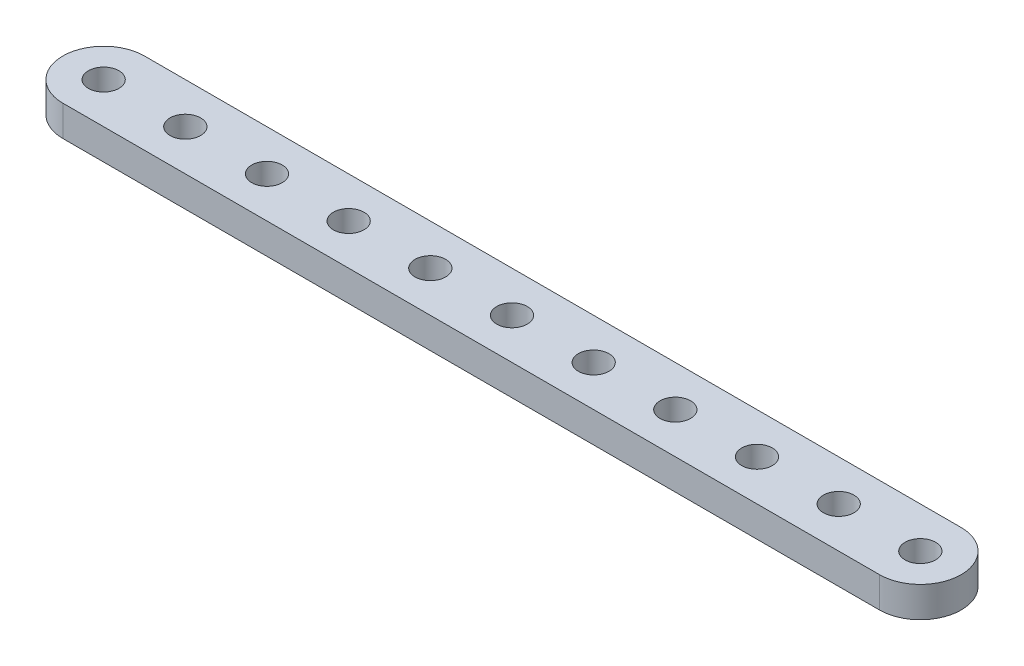
ISO-10303-21;
HEADER;
FILE_DESCRIPTION(('STEP AP214'),'2;1');
FILE_NAME('part.step','',(''),(''),'','','');
FILE_SCHEMA(('AUTOMOTIVE_DESIGN { 1 0 10303 214 1 1 1 1 }'));
ENDSEC;
DATA;
#1=APPLICATION_CONTEXT('core data for automotive mechanical design processes');
#2=APPLICATION_PROTOCOL_DEFINITION('international standard','automotive_design',2000,#1);
#3=PRODUCT_CONTEXT('',#1,'mechanical');
#4=PRODUCT('Part','Part','',(#3));
#5=PRODUCT_RELATED_PRODUCT_CATEGORY('part','',(#4));
#6=PRODUCT_DEFINITION_FORMATION('','',#4);
#7=PRODUCT_DEFINITION_CONTEXT('part definition',#1,'design');
#8=PRODUCT_DEFINITION('design','',#6,#7);
#9=PRODUCT_DEFINITION_SHAPE('','',#8);
#10=(LENGTH_UNIT() NAMED_UNIT(*) SI_UNIT(.MILLI.,.METRE.));
#11=(NAMED_UNIT(*) PLANE_ANGLE_UNIT() SI_UNIT($,.RADIAN.));
#12=(NAMED_UNIT(*) SI_UNIT($,.STERADIAN.) SOLID_ANGLE_UNIT());
#13=UNCERTAINTY_MEASURE_WITH_UNIT(LENGTH_MEASURE(1.E-05),#10,'distance_accuracy_value','');
#14=(GEOMETRIC_REPRESENTATION_CONTEXT(3) GLOBAL_UNCERTAINTY_ASSIGNED_CONTEXT((#13)) GLOBAL_UNIT_ASSIGNED_CONTEXT((#10,
#11,#12)) REPRESENTATION_CONTEXT('',''));
#15=CARTESIAN_POINT('',(0.,0.,0.));
#16=DIRECTION('',(0.,0.,1.));
#17=DIRECTION('',(1.,0.,0.));
#18=AXIS2_PLACEMENT_3D('',#15,#16,#17);
#19=CARTESIAN_POINT('',(0.,3.,0.));
#20=DIRECTION('',(0.,1.,0.));
#21=DIRECTION('',(0.,0.,1.));
#22=AXIS2_PLACEMENT_3D('',#19,#20,#21);
#23=PLANE('',#22);
#24=CARTESIAN_POINT('',(72.0000000000001,3.,0.));
#25=DIRECTION('',(0.,1.,0.));
#26=DIRECTION('',(0.,0.,1.));
#27=AXIS2_PLACEMENT_3D('',#24,#25,#26);
#28=CIRCLE('',#27,1.5);
#29=CARTESIAN_POINT('',(72.0000000000001,3.,1.5));
#30=VERTEX_POINT('',#29);
#31=EDGE_CURVE('E172',#30,#30,#28,.T.);
#32=ORIENTED_EDGE('',*,*,#31,.F.);
#33=EDGE_LOOP('',(#32));
#34=FACE_BOUND('',#33,.T.);
#35=CARTESIAN_POINT('',(56.,3.,0.));
#36=DIRECTION('',(0.,1.,0.));
#37=DIRECTION('',(0.,0.,1.));
#38=AXIS2_PLACEMENT_3D('',#35,#36,#37);
#39=CIRCLE('',#38,1.5);
#40=CARTESIAN_POINT('',(56.,3.,1.49999999999999));
#41=VERTEX_POINT('',#40);
#42=EDGE_CURVE('E160',#41,#41,#39,.T.);
#43=ORIENTED_EDGE('',*,*,#42,.F.);
#44=EDGE_LOOP('',(#43));
#45=FACE_BOUND('',#44,.T.);
#46=CARTESIAN_POINT('',(40.,3.,0.));
#47=DIRECTION('',(0.,1.,0.));
#48=DIRECTION('',(0.,0.,1.));
#49=AXIS2_PLACEMENT_3D('',#46,#47,#48);
#50=CIRCLE('',#49,1.5);
#51=CARTESIAN_POINT('',(40.,3.,1.5));
#52=VERTEX_POINT('',#51);
#53=EDGE_CURVE('E148',#52,#52,#50,.T.);
#54=ORIENTED_EDGE('',*,*,#53,.F.);
#55=EDGE_LOOP('',(#54));
#56=FACE_BOUND('',#55,.T.);
#57=CARTESIAN_POINT('',(24.,3.,0.));
#58=DIRECTION('',(0.,1.,0.));
#59=DIRECTION('',(0.,0.,1.));
#60=AXIS2_PLACEMENT_3D('',#57,#58,#59);
#61=CIRCLE('',#60,1.5);
#62=CARTESIAN_POINT('',(24.,3.,1.5));
#63=VERTEX_POINT('',#62);
#64=EDGE_CURVE('E136',#63,#63,#61,.T.);
#65=ORIENTED_EDGE('',*,*,#64,.F.);
#66=EDGE_LOOP('',(#65));
#67=FACE_BOUND('',#66,.T.);
#68=CARTESIAN_POINT('',(7.99999999999998,3.,0.));
#69=DIRECTION('',(0.,1.,0.));
#70=DIRECTION('',(0.,0.,1.));
#71=AXIS2_PLACEMENT_3D('',#68,#69,#70);
#72=CIRCLE('',#71,1.5);
#73=CARTESIAN_POINT('',(7.99999999999998,3.,1.50000000000001));
#74=VERTEX_POINT('',#73);
#75=EDGE_CURVE('E124',#74,#74,#72,.T.);
#76=ORIENTED_EDGE('',*,*,#75,.F.);
#77=EDGE_LOOP('',(#76));
#78=FACE_BOUND('',#77,.T.);
#79=CARTESIAN_POINT('',(0.,3.,0.));
#80=DIRECTION('',(0.,1.,0.));
#81=DIRECTION('',(0.,0.,1.));
#82=AXIS2_PLACEMENT_3D('',#79,#80,#81);
#83=CIRCLE('',#82,4.);
#84=CARTESIAN_POINT('',(0.,3.,-4.00000000000001));
#85=VERTEX_POINT('',#84);
#86=CARTESIAN_POINT('',(0.,3.,4.));
#87=VERTEX_POINT('',#86);
#88=EDGE_CURVE('E94',#85,#87,#83,.T.);
#89=ORIENTED_EDGE('',*,*,#88,.T.);
#90=DIRECTION('',(1.,0.,0.));
#91=VECTOR('',#90,1.);
#92=CARTESIAN_POINT('',(0.,3.,4.));
#93=LINE('',#92,#91);
#94=CARTESIAN_POINT('',(80.,3.,4.));
#95=VERTEX_POINT('',#94);
#96=EDGE_CURVE('E89',#87,#95,#93,.T.);
#97=ORIENTED_EDGE('',*,*,#96,.T.);
#98=CARTESIAN_POINT('',(80.,3.,0.));
#99=DIRECTION('',(0.,1.,0.));
#100=DIRECTION('',(0.,0.,1.));
#101=AXIS2_PLACEMENT_3D('',#98,#99,#100);
#102=CIRCLE('',#101,4.);
#103=CARTESIAN_POINT('',(80.,3.,-4.));
#104=VERTEX_POINT('',#103);
#105=EDGE_CURVE('E92',#95,#104,#102,.T.);
#106=ORIENTED_EDGE('',*,*,#105,.T.);
#107=DIRECTION('',(-1.,0.,0.));
#108=VECTOR('',#107,1.);
#109=CARTESIAN_POINT('',(0.,3.,-4.00000000000001));
#110=LINE('',#109,#108);
#111=EDGE_CURVE('E59',#104,#85,#110,.T.);
#112=ORIENTED_EDGE('',*,*,#111,.T.);
#113=EDGE_LOOP('',(#89,#97,#106,#112));
#114=FACE_BOUND('',#113,.T.);
#115=CARTESIAN_POINT('',(0.,3.,0.));
#116=DIRECTION('',(0.,1.,0.));
#117=DIRECTION('',(0.,0.,1.));
#118=AXIS2_PLACEMENT_3D('',#115,#116,#117);
#119=CIRCLE('',#118,1.5);
#120=CARTESIAN_POINT('',(0.,3.,1.5));
#121=VERTEX_POINT('',#120);
#122=EDGE_CURVE('E109',#121,#121,#119,.T.);
#123=ORIENTED_EDGE('',*,*,#122,.F.);
#124=EDGE_LOOP('',(#123));
#125=FACE_BOUND('',#124,.T.);
#126=CARTESIAN_POINT('',(16.,3.,0.));
#127=DIRECTION('',(0.,1.,0.));
#128=DIRECTION('',(0.,0.,1.));
#129=AXIS2_PLACEMENT_3D('',#126,#127,#128);
#130=CIRCLE('',#129,1.5);
#131=CARTESIAN_POINT('',(16.,3.,1.50000000000001));
#132=VERTEX_POINT('',#131);
#133=EDGE_CURVE('E130',#132,#132,#130,.T.);
#134=ORIENTED_EDGE('',*,*,#133,.F.);
#135=EDGE_LOOP('',(#134));
#136=FACE_BOUND('',#135,.T.);
#137=CARTESIAN_POINT('',(32.,3.,0.));
#138=DIRECTION('',(0.,1.,0.));
#139=DIRECTION('',(0.,0.,1.));
#140=AXIS2_PLACEMENT_3D('',#137,#138,#139);
#141=CIRCLE('',#140,1.5);
#142=CARTESIAN_POINT('',(32.,3.,1.5));
#143=VERTEX_POINT('',#142);
#144=EDGE_CURVE('E142',#143,#143,#141,.T.);
#145=ORIENTED_EDGE('',*,*,#144,.F.);
#146=EDGE_LOOP('',(#145));
#147=FACE_BOUND('',#146,.T.);
#148=CARTESIAN_POINT('',(48.,3.,0.));
#149=DIRECTION('',(0.,1.,0.));
#150=DIRECTION('',(0.,0.,1.));
#151=AXIS2_PLACEMENT_3D('',#148,#149,#150);
#152=CIRCLE('',#151,1.5);
#153=CARTESIAN_POINT('',(48.,3.,1.5));
#154=VERTEX_POINT('',#153);
#155=EDGE_CURVE('E154',#154,#154,#152,.T.);
#156=ORIENTED_EDGE('',*,*,#155,.F.);
#157=EDGE_LOOP('',(#156));
#158=FACE_BOUND('',#157,.T.);
#159=CARTESIAN_POINT('',(64.,3.,0.));
#160=DIRECTION('',(0.,1.,0.));
#161=DIRECTION('',(0.,0.,1.));
#162=AXIS2_PLACEMENT_3D('',#159,#160,#161);
#163=CIRCLE('',#162,1.5);
#164=CARTESIAN_POINT('',(64.,3.,1.49999999999999));
#165=VERTEX_POINT('',#164);
#166=EDGE_CURVE('E166',#165,#165,#163,.T.);
#167=ORIENTED_EDGE('',*,*,#166,.F.);
#168=EDGE_LOOP('',(#167));
#169=FACE_BOUND('',#168,.T.);
#170=CARTESIAN_POINT('',(80.,3.,0.));
#171=DIRECTION('',(0.,1.,0.));
#172=DIRECTION('',(0.,0.,1.));
#173=AXIS2_PLACEMENT_3D('',#170,#171,#172);
#174=CIRCLE('',#173,1.5);
#175=CARTESIAN_POINT('',(80.,3.,1.5));
#176=VERTEX_POINT('',#175);
#177=EDGE_CURVE('E178',#176,#176,#174,.T.);
#178=ORIENTED_EDGE('',*,*,#177,.F.);
#179=EDGE_LOOP('',(#178));
#180=FACE_BOUND('',#179,.T.);
#181=ADVANCED_FACE('F42',(#34,#45,#56,#67,#78,#114,#125,#136,#147,#158,#169,#180),#23,.T.);
#182=CARTESIAN_POINT('',(0.,0.,0.));
#183=DIRECTION('',(0.,1.,0.));
#184=DIRECTION('',(0.,0.,1.));
#185=AXIS2_PLACEMENT_3D('',#182,#183,#184);
#186=PLANE('',#185);
#187=CARTESIAN_POINT('',(72.0000000000001,0.,0.));
#188=DIRECTION('',(0.,1.,0.));
#189=DIRECTION('',(0.,0.,1.));
#190=AXIS2_PLACEMENT_3D('',#187,#188,#189);
#191=CIRCLE('',#190,1.5);
#192=CARTESIAN_POINT('',(72.0000000000001,0.,1.5));
#193=VERTEX_POINT('',#192);
#194=EDGE_CURVE('E175',#193,#193,#191,.T.);
#195=ORIENTED_EDGE('',*,*,#194,.T.);
#196=EDGE_LOOP('',(#195));
#197=FACE_BOUND('',#196,.T.);
#198=CARTESIAN_POINT('',(56.,0.,0.));
#199=DIRECTION('',(0.,1.,0.));
#200=DIRECTION('',(0.,0.,1.));
#201=AXIS2_PLACEMENT_3D('',#198,#199,#200);
#202=CIRCLE('',#201,1.5);
#203=CARTESIAN_POINT('',(56.,0.,1.49999999999999));
#204=VERTEX_POINT('',#203);
#205=EDGE_CURVE('E163',#204,#204,#202,.T.);
#206=ORIENTED_EDGE('',*,*,#205,.T.);
#207=EDGE_LOOP('',(#206));
#208=FACE_BOUND('',#207,.T.);
#209=CARTESIAN_POINT('',(40.,0.,0.));
#210=DIRECTION('',(0.,1.,0.));
#211=DIRECTION('',(0.,0.,1.));
#212=AXIS2_PLACEMENT_3D('',#209,#210,#211);
#213=CIRCLE('',#212,1.5);
#214=CARTESIAN_POINT('',(40.,0.,1.5));
#215=VERTEX_POINT('',#214);
#216=EDGE_CURVE('E151',#215,#215,#213,.T.);
#217=ORIENTED_EDGE('',*,*,#216,.T.);
#218=EDGE_LOOP('',(#217));
#219=FACE_BOUND('',#218,.T.);
#220=CARTESIAN_POINT('',(24.,0.,0.));
#221=DIRECTION('',(0.,1.,0.));
#222=DIRECTION('',(0.,0.,1.));
#223=AXIS2_PLACEMENT_3D('',#220,#221,#222);
#224=CIRCLE('',#223,1.5);
#225=CARTESIAN_POINT('',(24.,0.,1.5));
#226=VERTEX_POINT('',#225);
#227=EDGE_CURVE('E139',#226,#226,#224,.T.);
#228=ORIENTED_EDGE('',*,*,#227,.T.);
#229=EDGE_LOOP('',(#228));
#230=FACE_BOUND('',#229,.T.);
#231=CARTESIAN_POINT('',(7.99999999999998,0.,0.));
#232=DIRECTION('',(0.,1.,0.));
#233=DIRECTION('',(0.,0.,1.));
#234=AXIS2_PLACEMENT_3D('',#231,#232,#233);
#235=CIRCLE('',#234,1.5);
#236=CARTESIAN_POINT('',(7.99999999999998,0.,1.50000000000001));
#237=VERTEX_POINT('',#236);
#238=EDGE_CURVE('E127',#237,#237,#235,.T.);
#239=ORIENTED_EDGE('',*,*,#238,.T.);
#240=EDGE_LOOP('',(#239));
#241=FACE_BOUND('',#240,.T.);
#242=CARTESIAN_POINT('',(0.,0.,0.));
#243=DIRECTION('',(0.,1.,0.));
#244=DIRECTION('',(0.,0.,1.));
#245=AXIS2_PLACEMENT_3D('',#242,#243,#244);
#246=CIRCLE('',#245,4.);
#247=CARTESIAN_POINT('',(0.,0.,-4.00000000000001));
#248=VERTEX_POINT('',#247);
#249=CARTESIAN_POINT('',(0.,0.,4.));
#250=VERTEX_POINT('',#249);
#251=EDGE_CURVE('E106',#248,#250,#246,.T.);
#252=ORIENTED_EDGE('',*,*,#251,.F.);
#253=DIRECTION('',(-1.,0.,0.));
#254=VECTOR('',#253,1.);
#255=CARTESIAN_POINT('',(0.,0.,-4.00000000000001));
#256=LINE('',#255,#254);
#257=CARTESIAN_POINT('',(80.,0.,-4.));
#258=VERTEX_POINT('',#257);
#259=EDGE_CURVE('E82',#258,#248,#256,.T.);
#260=ORIENTED_EDGE('',*,*,#259,.F.);
#261=CARTESIAN_POINT('',(80.,0.,0.));
#262=DIRECTION('',(0.,1.,0.));
#263=DIRECTION('',(0.,0.,1.));
#264=AXIS2_PLACEMENT_3D('',#261,#262,#263);
#265=CIRCLE('',#264,4.);
#266=CARTESIAN_POINT('',(80.,0.,4.));
#267=VERTEX_POINT('',#266);
#268=EDGE_CURVE('E76',#267,#258,#265,.T.);
#269=ORIENTED_EDGE('',*,*,#268,.F.);
#270=DIRECTION('',(1.,0.,0.));
#271=VECTOR('',#270,1.);
#272=CARTESIAN_POINT('',(0.,0.,4.));
#273=LINE('',#272,#271);
#274=EDGE_CURVE('E98',#250,#267,#273,.T.);
#275=ORIENTED_EDGE('',*,*,#274,.F.);
#276=EDGE_LOOP('',(#252,#260,#269,#275));
#277=FACE_BOUND('',#276,.T.);
#278=CARTESIAN_POINT('',(0.,0.,0.));
#279=DIRECTION('',(0.,1.,0.));
#280=DIRECTION('',(0.,0.,1.));
#281=AXIS2_PLACEMENT_3D('',#278,#279,#280);
#282=CIRCLE('',#281,1.5);
#283=CARTESIAN_POINT('',(0.,0.,1.5));
#284=VERTEX_POINT('',#283);
#285=EDGE_CURVE('E121',#284,#284,#282,.T.);
#286=ORIENTED_EDGE('',*,*,#285,.T.);
#287=EDGE_LOOP('',(#286));
#288=FACE_BOUND('',#287,.T.);
#289=CARTESIAN_POINT('',(16.,0.,0.));
#290=DIRECTION('',(0.,1.,0.));
#291=DIRECTION('',(0.,0.,1.));
#292=AXIS2_PLACEMENT_3D('',#289,#290,#291);
#293=CIRCLE('',#292,1.5);
#294=CARTESIAN_POINT('',(16.,0.,1.50000000000001));
#295=VERTEX_POINT('',#294);
#296=EDGE_CURVE('E133',#295,#295,#293,.T.);
#297=ORIENTED_EDGE('',*,*,#296,.T.);
#298=EDGE_LOOP('',(#297));
#299=FACE_BOUND('',#298,.T.);
#300=CARTESIAN_POINT('',(32.,0.,0.));
#301=DIRECTION('',(0.,1.,0.));
#302=DIRECTION('',(0.,0.,1.));
#303=AXIS2_PLACEMENT_3D('',#300,#301,#302);
#304=CIRCLE('',#303,1.5);
#305=CARTESIAN_POINT('',(32.,0.,1.5));
#306=VERTEX_POINT('',#305);
#307=EDGE_CURVE('E145',#306,#306,#304,.T.);
#308=ORIENTED_EDGE('',*,*,#307,.T.);
#309=EDGE_LOOP('',(#308));
#310=FACE_BOUND('',#309,.T.);
#311=CARTESIAN_POINT('',(48.,0.,0.));
#312=DIRECTION('',(0.,1.,0.));
#313=DIRECTION('',(0.,0.,1.));
#314=AXIS2_PLACEMENT_3D('',#311,#312,#313);
#315=CIRCLE('',#314,1.5);
#316=CARTESIAN_POINT('',(48.,0.,1.5));
#317=VERTEX_POINT('',#316);
#318=EDGE_CURVE('E157',#317,#317,#315,.T.);
#319=ORIENTED_EDGE('',*,*,#318,.T.);
#320=EDGE_LOOP('',(#319));
#321=FACE_BOUND('',#320,.T.);
#322=CARTESIAN_POINT('',(64.,0.,0.));
#323=DIRECTION('',(0.,1.,0.));
#324=DIRECTION('',(0.,0.,1.));
#325=AXIS2_PLACEMENT_3D('',#322,#323,#324);
#326=CIRCLE('',#325,1.5);
#327=CARTESIAN_POINT('',(64.,0.,1.49999999999999));
#328=VERTEX_POINT('',#327);
#329=EDGE_CURVE('E169',#328,#328,#326,.T.);
#330=ORIENTED_EDGE('',*,*,#329,.T.);
#331=EDGE_LOOP('',(#330));
#332=FACE_BOUND('',#331,.T.);
#333=CARTESIAN_POINT('',(80.,0.,0.));
#334=DIRECTION('',(0.,1.,0.));
#335=DIRECTION('',(0.,0.,1.));
#336=AXIS2_PLACEMENT_3D('',#333,#334,#335);
#337=CIRCLE('',#336,1.5);
#338=CARTESIAN_POINT('',(80.,0.,1.5));
#339=VERTEX_POINT('',#338);
#340=EDGE_CURVE('E181',#339,#339,#337,.T.);
#341=ORIENTED_EDGE('',*,*,#340,.T.);
#342=EDGE_LOOP('',(#341));
#343=FACE_BOUND('',#342,.T.);
#344=ADVANCED_FACE('F117',(#197,#208,#219,#230,#241,#277,#288,#299,#310,#321,#332,#343),#186,.F.);
#345=CARTESIAN_POINT('',(0.,3.,0.));
#346=DIRECTION('',(0.,-1.,0.));
#347=DIRECTION('',(0.,0.,-1.));
#348=AXIS2_PLACEMENT_3D('',#345,#346,#347);
#349=CYLINDRICAL_SURFACE('',#348,4.);
#350=ORIENTED_EDGE('',*,*,#251,.T.);
#351=DIRECTION('',(0.,-1.,0.));
#352=VECTOR('',#351,1.);
#353=CARTESIAN_POINT('',(0.,3.,4.));
#354=LINE('',#353,#352);
#355=EDGE_CURVE('E13',#87,#250,#354,.T.);
#356=ORIENTED_EDGE('',*,*,#355,.F.);
#357=ORIENTED_EDGE('',*,*,#88,.F.);
#358=DIRECTION('',(0.,-1.,0.));
#359=VECTOR('',#358,1.);
#360=CARTESIAN_POINT('',(0.,3.,-4.00000000000001));
#361=LINE('',#360,#359);
#362=EDGE_CURVE('E102',#85,#248,#361,.T.);
#363=ORIENTED_EDGE('',*,*,#362,.T.);
#364=EDGE_LOOP('',(#350,#356,#357,#363));
#365=FACE_BOUND('',#364,.T.);
#366=ADVANCED_FACE('F44',(#365),#349,.T.);
#367=CARTESIAN_POINT('',(0.,3.,4.));
#368=DIRECTION('',(0.,0.,-1.));
#369=DIRECTION('',(-1.,0.,0.));
#370=AXIS2_PLACEMENT_3D('',#367,#368,#369);
#371=PLANE('',#370);
#372=ORIENTED_EDGE('',*,*,#274,.T.);
#373=DIRECTION('',(0.,-1.,0.));
#374=VECTOR('',#373,1.);
#375=CARTESIAN_POINT('',(80.,3.,4.));
#376=LINE('',#375,#374);
#377=EDGE_CURVE('E51',#95,#267,#376,.T.);
#378=ORIENTED_EDGE('',*,*,#377,.F.);
#379=ORIENTED_EDGE('',*,*,#96,.F.);
#380=ORIENTED_EDGE('',*,*,#355,.T.);
#381=EDGE_LOOP('',(#372,#378,#379,#380));
#382=FACE_BOUND('',#381,.T.);
#383=ADVANCED_FACE('F97',(#382),#371,.F.);
#384=CARTESIAN_POINT('',(80.,3.,0.));
#385=DIRECTION('',(0.,-1.,0.));
#386=DIRECTION('',(0.,0.,-1.));
#387=AXIS2_PLACEMENT_3D('',#384,#385,#386);
#388=CYLINDRICAL_SURFACE('',#387,4.);
#389=ORIENTED_EDGE('',*,*,#268,.T.);
#390=DIRECTION('',(0.,-1.,0.));
#391=VECTOR('',#390,1.);
#392=CARTESIAN_POINT('',(80.,3.,-4.));
#393=LINE('',#392,#391);
#394=EDGE_CURVE('E99',#104,#258,#393,.T.);
#395=ORIENTED_EDGE('',*,*,#394,.F.);
#396=ORIENTED_EDGE('',*,*,#105,.F.);
#397=ORIENTED_EDGE('',*,*,#377,.T.);
#398=EDGE_LOOP('',(#389,#395,#396,#397));
#399=FACE_BOUND('',#398,.T.);
#400=ADVANCED_FACE('F100',(#399),#388,.T.);
#401=CARTESIAN_POINT('',(0.,3.,-4.00000000000001));
#402=DIRECTION('',(0.,0.,1.));
#403=DIRECTION('',(1.,0.,0.));
#404=AXIS2_PLACEMENT_3D('',#401,#402,#403);
#405=PLANE('',#404);
#406=ORIENTED_EDGE('',*,*,#259,.T.);
#407=ORIENTED_EDGE('',*,*,#362,.F.);
#408=ORIENTED_EDGE('',*,*,#111,.F.);
#409=ORIENTED_EDGE('',*,*,#394,.T.);
#410=EDGE_LOOP('',(#406,#407,#408,#409));
#411=FACE_BOUND('',#410,.T.);
#412=ADVANCED_FACE('F114',(#411),#405,.F.);
#413=CARTESIAN_POINT('',(0.,3.,0.));
#414=DIRECTION('',(0.,-1.,0.));
#415=DIRECTION('',(0.,0.,-1.));
#416=AXIS2_PLACEMENT_3D('',#413,#414,#415);
#417=CYLINDRICAL_SURFACE('',#416,1.5);
#418=ORIENTED_EDGE('',*,*,#122,.T.);
#419=EDGE_LOOP('',(#418));
#420=FACE_BOUND('',#419,.T.);
#421=ORIENTED_EDGE('',*,*,#285,.F.);
#422=EDGE_LOOP('',(#421));
#423=FACE_BOUND('',#422,.T.);
#424=ADVANCED_FACE('F201',(#420,#423),#417,.F.);
#425=CARTESIAN_POINT('',(7.99999999999998,3.,0.));
#426=DIRECTION('',(0.,-1.,0.));
#427=DIRECTION('',(0.,0.,-1.));
#428=AXIS2_PLACEMENT_3D('',#425,#426,#427);
#429=CYLINDRICAL_SURFACE('',#428,1.5);
#430=ORIENTED_EDGE('',*,*,#75,.T.);
#431=EDGE_LOOP('',(#430));
#432=FACE_BOUND('',#431,.T.);
#433=ORIENTED_EDGE('',*,*,#238,.F.);
#434=EDGE_LOOP('',(#433));
#435=FACE_BOUND('',#434,.T.);
#436=ADVANCED_FACE('F236',(#432,#435),#429,.F.);
#437=CARTESIAN_POINT('',(16.,3.,0.));
#438=DIRECTION('',(0.,-1.,0.));
#439=DIRECTION('',(0.,0.,-1.));
#440=AXIS2_PLACEMENT_3D('',#437,#438,#439);
#441=CYLINDRICAL_SURFACE('',#440,1.5);
#442=ORIENTED_EDGE('',*,*,#133,.T.);
#443=EDGE_LOOP('',(#442));
#444=FACE_BOUND('',#443,.T.);
#445=ORIENTED_EDGE('',*,*,#296,.F.);
#446=EDGE_LOOP('',(#445));
#447=FACE_BOUND('',#446,.T.);
#448=ADVANCED_FACE('F243',(#444,#447),#441,.F.);
#449=CARTESIAN_POINT('',(24.,3.,0.));
#450=DIRECTION('',(0.,-1.,0.));
#451=DIRECTION('',(0.,0.,-1.));
#452=AXIS2_PLACEMENT_3D('',#449,#450,#451);
#453=CYLINDRICAL_SURFACE('',#452,1.5);
#454=ORIENTED_EDGE('',*,*,#64,.T.);
#455=EDGE_LOOP('',(#454));
#456=FACE_BOUND('',#455,.T.);
#457=ORIENTED_EDGE('',*,*,#227,.F.);
#458=EDGE_LOOP('',(#457));
#459=FACE_BOUND('',#458,.T.);
#460=ADVANCED_FACE('F250',(#456,#459),#453,.F.);
#461=CARTESIAN_POINT('',(32.,3.,0.));
#462=DIRECTION('',(0.,-1.,0.));
#463=DIRECTION('',(0.,0.,-1.));
#464=AXIS2_PLACEMENT_3D('',#461,#462,#463);
#465=CYLINDRICAL_SURFACE('',#464,1.5);
#466=ORIENTED_EDGE('',*,*,#144,.T.);
#467=EDGE_LOOP('',(#466));
#468=FACE_BOUND('',#467,.T.);
#469=ORIENTED_EDGE('',*,*,#307,.F.);
#470=EDGE_LOOP('',(#469));
#471=FACE_BOUND('',#470,.T.);
#472=ADVANCED_FACE('F258',(#468,#471),#465,.F.);
#473=CARTESIAN_POINT('',(40.,3.,0.));
#474=DIRECTION('',(0.,-1.,0.));
#475=DIRECTION('',(0.,0.,-1.));
#476=AXIS2_PLACEMENT_3D('',#473,#474,#475);
#477=CYLINDRICAL_SURFACE('',#476,1.5);
#478=ORIENTED_EDGE('',*,*,#53,.T.);
#479=EDGE_LOOP('',(#478));
#480=FACE_BOUND('',#479,.T.);
#481=ORIENTED_EDGE('',*,*,#216,.F.);
#482=EDGE_LOOP('',(#481));
#483=FACE_BOUND('',#482,.T.);
#484=ADVANCED_FACE('F266',(#480,#483),#477,.F.);
#485=CARTESIAN_POINT('',(48.,3.,0.));
#486=DIRECTION('',(0.,-1.,0.));
#487=DIRECTION('',(0.,0.,-1.));
#488=AXIS2_PLACEMENT_3D('',#485,#486,#487);
#489=CYLINDRICAL_SURFACE('',#488,1.5);
#490=ORIENTED_EDGE('',*,*,#155,.T.);
#491=EDGE_LOOP('',(#490));
#492=FACE_BOUND('',#491,.T.);
#493=ORIENTED_EDGE('',*,*,#318,.F.);
#494=EDGE_LOOP('',(#493));
#495=FACE_BOUND('',#494,.T.);
#496=ADVANCED_FACE('F274',(#492,#495),#489,.F.);
#497=CARTESIAN_POINT('',(56.,3.,0.));
#498=DIRECTION('',(0.,-1.,0.));
#499=DIRECTION('',(0.,0.,-1.));
#500=AXIS2_PLACEMENT_3D('',#497,#498,#499);
#501=CYLINDRICAL_SURFACE('',#500,1.5);
#502=ORIENTED_EDGE('',*,*,#42,.T.);
#503=EDGE_LOOP('',(#502));
#504=FACE_BOUND('',#503,.T.);
#505=ORIENTED_EDGE('',*,*,#205,.F.);
#506=EDGE_LOOP('',(#505));
#507=FACE_BOUND('',#506,.T.);
#508=ADVANCED_FACE('F282',(#504,#507),#501,.F.);
#509=CARTESIAN_POINT('',(64.,3.,0.));
#510=DIRECTION('',(0.,-1.,0.));
#511=DIRECTION('',(0.,0.,-1.));
#512=AXIS2_PLACEMENT_3D('',#509,#510,#511);
#513=CYLINDRICAL_SURFACE('',#512,1.5);
#514=ORIENTED_EDGE('',*,*,#166,.T.);
#515=EDGE_LOOP('',(#514));
#516=FACE_BOUND('',#515,.T.);
#517=ORIENTED_EDGE('',*,*,#329,.F.);
#518=EDGE_LOOP('',(#517));
#519=FACE_BOUND('',#518,.T.);
#520=ADVANCED_FACE('F290',(#516,#519),#513,.F.);
#521=CARTESIAN_POINT('',(72.0000000000001,3.,0.));
#522=DIRECTION('',(0.,-1.,0.));
#523=DIRECTION('',(0.,0.,-1.));
#524=AXIS2_PLACEMENT_3D('',#521,#522,#523);
#525=CYLINDRICAL_SURFACE('',#524,1.5);
#526=ORIENTED_EDGE('',*,*,#31,.T.);
#527=EDGE_LOOP('',(#526));
#528=FACE_BOUND('',#527,.T.);
#529=ORIENTED_EDGE('',*,*,#194,.F.);
#530=EDGE_LOOP('',(#529));
#531=FACE_BOUND('',#530,.T.);
#532=ADVANCED_FACE('F298',(#528,#531),#525,.F.);
#533=CARTESIAN_POINT('',(80.,3.,0.));
#534=DIRECTION('',(0.,-1.,0.));
#535=DIRECTION('',(0.,0.,-1.));
#536=AXIS2_PLACEMENT_3D('',#533,#534,#535);
#537=CYLINDRICAL_SURFACE('',#536,1.5);
#538=ORIENTED_EDGE('',*,*,#177,.T.);
#539=EDGE_LOOP('',(#538));
#540=FACE_BOUND('',#539,.T.);
#541=ORIENTED_EDGE('',*,*,#340,.F.);
#542=EDGE_LOOP('',(#541));
#543=FACE_BOUND('',#542,.T.);
#544=ADVANCED_FACE('F187',(#540,#543),#537,.F.);
#545=CLOSED_SHELL('',(#181,#344,#366,#383,#400,#412,#424,#436,#448,#460,#472,#484,#496,#508,
#520,#532,#544));
#546=MANIFOLD_SOLID_BREP('B2',#545);
#547=ADVANCED_BREP_SHAPE_REPRESENTATION('',(#18,#546),#14);
#548=SHAPE_DEFINITION_REPRESENTATION(#9,#547);
ENDSEC;
END-ISO-10303-21;
